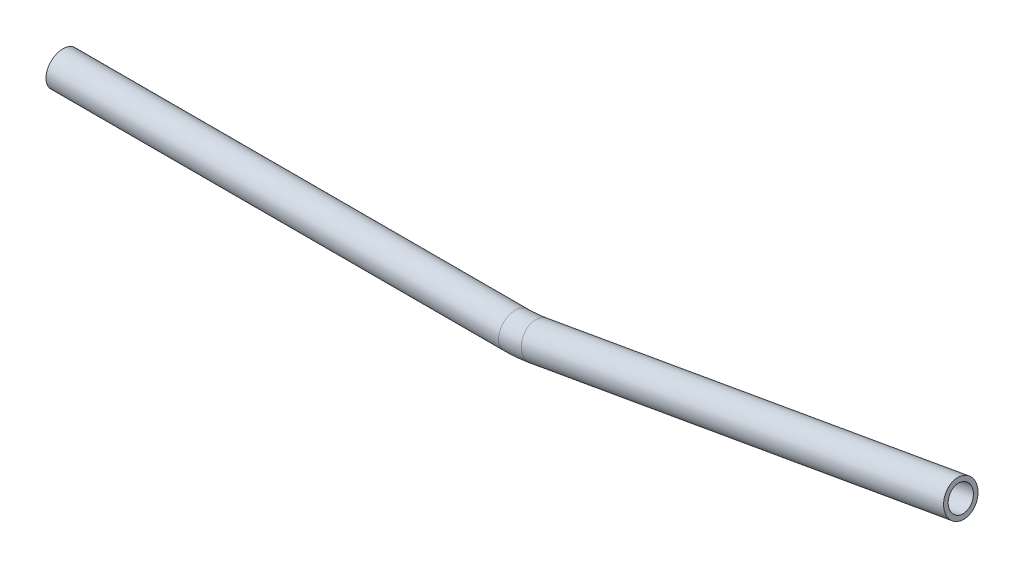
ISO-10303-21;
HEADER;
FILE_DESCRIPTION(('STEP AP214'),'2;1');
FILE_NAME('part.step','',(''),(''),'','','');
FILE_SCHEMA(('AUTOMOTIVE_DESIGN { 1 0 10303 214 1 1 1 1 }'));
ENDSEC;
DATA;
#1=APPLICATION_CONTEXT('core data for automotive mechanical design processes');
#2=APPLICATION_PROTOCOL_DEFINITION('international standard','automotive_design',2000,#1);
#3=PRODUCT_CONTEXT('',#1,'mechanical');
#4=PRODUCT('Part','Part','',(#3));
#5=PRODUCT_RELATED_PRODUCT_CATEGORY('part','',(#4));
#6=PRODUCT_DEFINITION_FORMATION('','',#4);
#7=PRODUCT_DEFINITION_CONTEXT('part definition',#1,'design');
#8=PRODUCT_DEFINITION('design','',#6,#7);
#9=PRODUCT_DEFINITION_SHAPE('','',#8);
#10=(LENGTH_UNIT() NAMED_UNIT(*) SI_UNIT(.MILLI.,.METRE.));
#11=(NAMED_UNIT(*) PLANE_ANGLE_UNIT() SI_UNIT($,.RADIAN.));
#12=(NAMED_UNIT(*) SI_UNIT($,.STERADIAN.) SOLID_ANGLE_UNIT());
#13=UNCERTAINTY_MEASURE_WITH_UNIT(LENGTH_MEASURE(1.E-05),#10,'distance_accuracy_value','');
#14=(GEOMETRIC_REPRESENTATION_CONTEXT(3) GLOBAL_UNCERTAINTY_ASSIGNED_CONTEXT((#13)) GLOBAL_UNIT_ASSIGNED_CONTEXT((#10,
#11,#12)) REPRESENTATION_CONTEXT('',''));
#15=CARTESIAN_POINT('',(0.,0.,0.));
#16=DIRECTION('',(0.,0.,1.));
#17=DIRECTION('',(1.,0.,0.));
#18=AXIS2_PLACEMENT_3D('',#15,#16,#17);
#19=CARTESIAN_POINT('',(-190.178402047366,-1.01100054882774,0.));
#20=DIRECTION('',(1.,0.,0.));
#21=DIRECTION('',(0.,1.,0.));
#22=AXIS2_PLACEMENT_3D('',#19,#20,#21);
#23=CYLINDRICAL_SURFACE('',#22,7.5);
#24=CARTESIAN_POINT('',(9.8215979526341,-1.01100054882773,0.));
#25=DIRECTION('',(1.,0.,0.));
#26=DIRECTION('',(0.,0.,-1.));
#27=AXIS2_PLACEMENT_3D('',#24,#25,#26);
#28=CIRCLE('',#27,7.5);
#29=CARTESIAN_POINT('',(9.8215979526341,-8.51100054882778,0.));
#30=VERTEX_POINT('',#29);
#31=EDGE_CURVE('E64',#30,#30,#28,.T.);
#32=ORIENTED_EDGE('',*,*,#31,.F.);
#33=EDGE_LOOP('',(#32));
#34=FACE_BOUND('',#33,.T.);
#35=CARTESIAN_POINT('',(-190.178402047366,-1.01100054882774,0.));
#36=DIRECTION('',(1.,0.,0.));
#37=DIRECTION('',(0.,0.,-1.));
#38=AXIS2_PLACEMENT_3D('',#35,#36,#37);
#39=CIRCLE('',#38,7.5);
#40=CARTESIAN_POINT('',(-190.178402047366,-1.01100054882774,-7.5));
#41=VERTEX_POINT('',#40);
#42=EDGE_CURVE('E61',#41,#41,#39,.T.);
#43=ORIENTED_EDGE('',*,*,#42,.T.);
#44=EDGE_LOOP('',(#43));
#45=FACE_BOUND('',#44,.T.);
#46=ADVANCED_FACE('F37',(#34,#45),#23,.T.);
#47=CARTESIAN_POINT('',(9.8215979526341,57.9409878997496,0.));
#48=DIRECTION('',(0.,0.,1.));
#49=DIRECTION('',(1.,0.,0.));
#50=AXIS2_PLACEMENT_3D('',#47,#48,#49);
#51=TOROIDAL_SURFACE('',#50,58.9519884485774,7.5);
#52=CARTESIAN_POINT('',(20.0585033165716,-0.115387379895464,0.));
#53=DIRECTION('',(0.984807753012208,0.173648177666932,0.));
#54=DIRECTION('',(0.,0.,-1.));
#55=AXIS2_PLACEMENT_3D('',#52,#53,#54);
#56=CIRCLE('',#55,7.5);
#57=CARTESIAN_POINT('',(21.3608646490736,-7.50144552748709,0.));
#58=VERTEX_POINT('',#57);
#59=EDGE_CURVE('E41',#58,#58,#56,.T.);
#60=CARTESIAN_POINT('',(9.8215979526341,57.9409878997496,0.));
#61=DIRECTION('',(0.,0.,1.));
#62=DIRECTION('',(1.,0.,0.));
#63=AXIS2_PLACEMENT_3D('',#60,#61,#62);
#64=CIRCLE('',#63,66.4519884485774);
#65=EDGE_CURVE('',#30,#58,#64,.T.);
#66=ORIENTED_EDGE('',*,*,#31,.T.);
#67=ORIENTED_EDGE('',*,*,#59,.F.);
#68=ORIENTED_EDGE('',*,*,#65,.T.);
#69=ORIENTED_EDGE('',*,*,#65,.F.);
#70=EDGE_LOOP('',(#66,#68,#67,#69));
#71=FACE_BOUND('',#70,.T.);
#72=ADVANCED_FACE('F74',(#71),#51,.T.);
#73=CARTESIAN_POINT('',(20.0585033165716,-0.115387379895478,0.));
#74=DIRECTION('',(0.984807753012208,0.173648177666931,0.));
#75=DIRECTION('',(-0.173648177666932,0.984807753012208,0.));
#76=AXIS2_PLACEMENT_3D('',#73,#74,#75);
#77=CYLINDRICAL_SURFACE('',#76,7.5);
#78=CARTESIAN_POINT('',(206.629507242055,32.7821144300324,0.));
#79=DIRECTION('',(0.984807753012208,0.173648177666931,0.));
#80=DIRECTION('',(0.,0.,-1.));
#81=AXIS2_PLACEMENT_3D('',#78,#79,#80);
#82=CIRCLE('',#81,7.5);
#83=CARTESIAN_POINT('',(206.629507242055,32.7821144300324,-7.5));
#84=VERTEX_POINT('',#83);
#85=EDGE_CURVE('E56',#84,#84,#82,.T.);
#86=ORIENTED_EDGE('',*,*,#85,.F.);
#87=EDGE_LOOP('',(#86));
#88=FACE_BOUND('',#87,.T.);
#89=ORIENTED_EDGE('',*,*,#59,.T.);
#90=EDGE_LOOP('',(#89));
#91=FACE_BOUND('',#90,.T.);
#92=ADVANCED_FACE('F39',(#88,#91),#77,.T.);
#93=CARTESIAN_POINT('',(-190.178402047366,-1.01100054882774,0.));
#94=DIRECTION('',(1.,0.,0.));
#95=DIRECTION('',(0.,0.,-1.));
#96=AXIS2_PLACEMENT_3D('',#93,#94,#95);
#97=PLANE('',#96);
#98=CARTESIAN_POINT('',(-190.178402047366,-1.01100054882774,0.));
#99=DIRECTION('',(1.,0.,0.));
#100=DIRECTION('',(0.,0.,-1.));
#101=AXIS2_PLACEMENT_3D('',#98,#99,#100);
#102=CIRCLE('',#101,5.5);
#103=CARTESIAN_POINT('',(-190.178402047366,-1.01100054882774,-5.5));
#104=VERTEX_POINT('',#103);
#105=EDGE_CURVE('E60',#104,#104,#102,.F.);
#106=ORIENTED_EDGE('',*,*,#105,.F.);
#107=EDGE_LOOP('',(#106));
#108=FACE_BOUND('',#107,.T.);
#109=ORIENTED_EDGE('',*,*,#42,.F.);
#110=EDGE_LOOP('',(#109));
#111=FACE_BOUND('',#110,.T.);
#112=ADVANCED_FACE('F80',(#108,#111),#97,.F.);
#113=CARTESIAN_POINT('',(206.629507242055,32.7821144300324,0.));
#114=DIRECTION('',(0.984807753012208,0.173648177666931,0.));
#115=DIRECTION('',(0.,0.,-1.));
#116=AXIS2_PLACEMENT_3D('',#113,#114,#115);
#117=PLANE('',#116);
#118=CARTESIAN_POINT('',(206.629507242055,32.7821144300324,0.));
#119=DIRECTION('',(0.984807753012208,0.173648177666931,0.));
#120=DIRECTION('',(0.,0.,-1.));
#121=AXIS2_PLACEMENT_3D('',#118,#119,#120);
#122=CIRCLE('',#121,5.5);
#123=CARTESIAN_POINT('',(206.629507242055,32.7821144300324,-5.5));
#124=VERTEX_POINT('',#123);
#125=EDGE_CURVE('E10',#124,#124,#122,.F.);
#126=ORIENTED_EDGE('',*,*,#125,.T.);
#127=EDGE_LOOP('',(#126));
#128=FACE_BOUND('',#127,.T.);
#129=ORIENTED_EDGE('',*,*,#85,.T.);
#130=EDGE_LOOP('',(#129));
#131=FACE_BOUND('',#130,.T.);
#132=ADVANCED_FACE('F98',(#128,#131),#117,.T.);
#133=CARTESIAN_POINT('',(-190.178402047366,-1.01100054882774,0.));
#134=DIRECTION('',(1.,0.,0.));
#135=DIRECTION('',(0.,1.,0.));
#136=AXIS2_PLACEMENT_3D('',#133,#134,#135);
#137=CYLINDRICAL_SURFACE('',#136,5.5);
#138=CARTESIAN_POINT('',(9.8215979526341,-1.01100054882773,0.));
#139=DIRECTION('',(1.,0.,0.));
#140=DIRECTION('',(0.,0.,-1.));
#141=AXIS2_PLACEMENT_3D('',#138,#139,#140);
#142=CIRCLE('',#141,5.5);
#143=CARTESIAN_POINT('',(9.8215979526341,-6.51100054882778,0.));
#144=VERTEX_POINT('',#143);
#145=EDGE_CURVE('E52',#144,#144,#142,.F.);
#146=ORIENTED_EDGE('',*,*,#145,.F.);
#147=EDGE_LOOP('',(#146));
#148=FACE_BOUND('',#147,.T.);
#149=ORIENTED_EDGE('',*,*,#105,.T.);
#150=EDGE_LOOP('',(#149));
#151=FACE_BOUND('',#150,.T.);
#152=ADVANCED_FACE('F92',(#148,#151),#137,.F.);
#153=CARTESIAN_POINT('',(9.8215979526341,57.9409878997496,0.));
#154=DIRECTION('',(0.,0.,1.));
#155=DIRECTION('',(1.,0.,0.));
#156=AXIS2_PLACEMENT_3D('',#153,#154,#155);
#157=TOROIDAL_SURFACE('',#156,58.9519884485774,5.5);
#158=CARTESIAN_POINT('',(20.0585033165716,-0.115387379895464,0.));
#159=DIRECTION('',(0.984807753012208,0.173648177666932,0.));
#160=DIRECTION('',(0.,0.,-1.));
#161=AXIS2_PLACEMENT_3D('',#158,#159,#160);
#162=CIRCLE('',#161,5.5);
#163=CARTESIAN_POINT('',(21.0135682937397,-5.53183002146267,0.));
#164=VERTEX_POINT('',#163);
#165=EDGE_CURVE('E46',#164,#164,#162,.F.);
#166=CARTESIAN_POINT('',(9.8215979526341,57.9409878997496,0.));
#167=DIRECTION('',(0.,0.,1.));
#168=DIRECTION('',(1.,0.,0.));
#169=AXIS2_PLACEMENT_3D('',#166,#167,#168);
#170=CIRCLE('',#169,64.4519884485774);
#171=EDGE_CURVE('',#144,#164,#170,.T.);
#172=ORIENTED_EDGE('',*,*,#145,.T.);
#173=ORIENTED_EDGE('',*,*,#165,.F.);
#174=ORIENTED_EDGE('',*,*,#171,.T.);
#175=ORIENTED_EDGE('',*,*,#171,.F.);
#176=EDGE_LOOP('',(#172,#174,#173,#175));
#177=FACE_BOUND('',#176,.T.);
#178=ADVANCED_FACE('F86',(#177),#157,.F.);
#179=CARTESIAN_POINT('',(20.0585033165716,-0.115387379895478,0.));
#180=DIRECTION('',(0.984807753012208,0.173648177666931,0.));
#181=DIRECTION('',(-0.173648177666932,0.984807753012208,0.));
#182=AXIS2_PLACEMENT_3D('',#179,#180,#181);
#183=CYLINDRICAL_SURFACE('',#182,5.5);
#184=ORIENTED_EDGE('',*,*,#125,.F.);
#185=EDGE_LOOP('',(#184));
#186=FACE_BOUND('',#185,.T.);
#187=ORIENTED_EDGE('',*,*,#165,.T.);
#188=EDGE_LOOP('',(#187));
#189=FACE_BOUND('',#188,.T.);
#190=ADVANCED_FACE('F84',(#186,#189),#183,.F.);
#191=CLOSED_SHELL('',(#46,#72,#92,#112,#132,#152,#178,#190));
#192=MANIFOLD_SOLID_BREP('B2',#191);
#193=ADVANCED_BREP_SHAPE_REPRESENTATION('',(#18,#192),#14);
#194=SHAPE_DEFINITION_REPRESENTATION(#9,#193);
ENDSEC;
END-ISO-10303-21;
